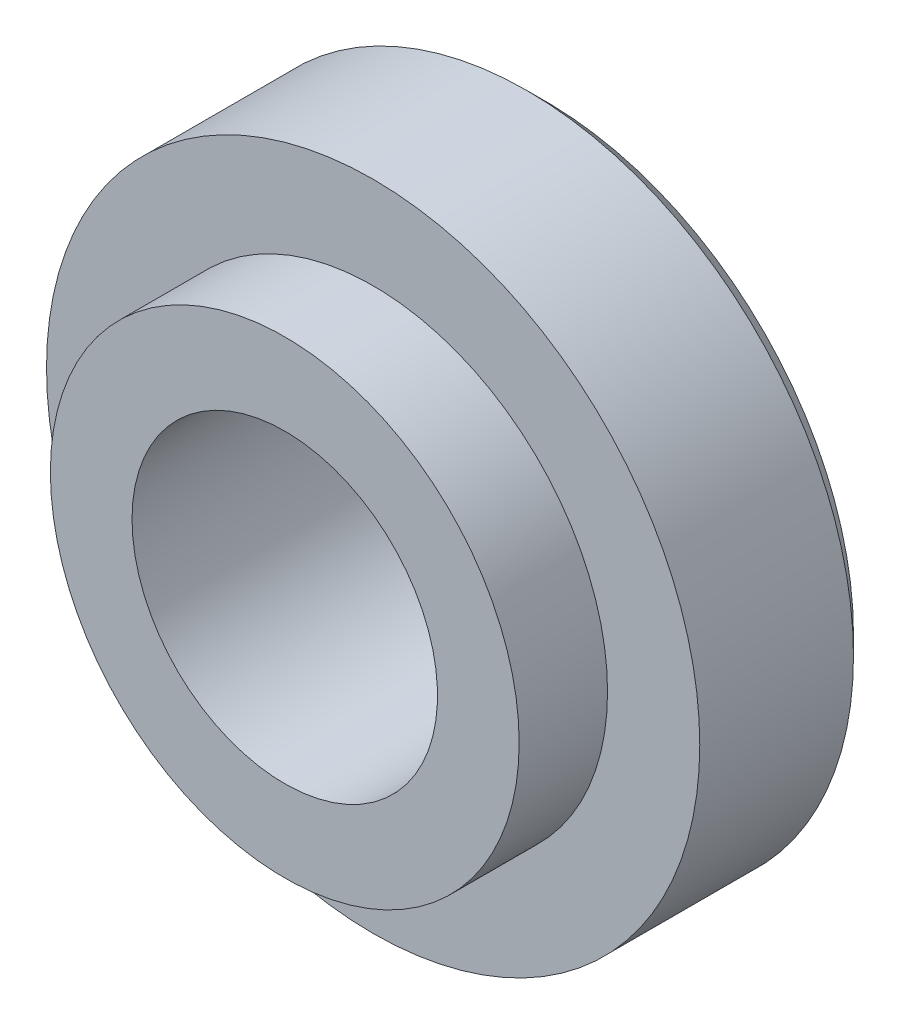
ISO-10303-21;
HEADER;
FILE_DESCRIPTION(('STEP AP214'),'2;1');
FILE_NAME('part.step','',(''),(''),'','','');
FILE_SCHEMA(('AUTOMOTIVE_DESIGN { 1 0 10303 214 1 1 1 1 }'));
ENDSEC;
DATA;
#1=APPLICATION_CONTEXT('core data for automotive mechanical design processes');
#2=APPLICATION_PROTOCOL_DEFINITION('international standard','automotive_design',2000,#1);
#3=PRODUCT_CONTEXT('',#1,'mechanical');
#4=PRODUCT('Part','Part','',(#3));
#5=PRODUCT_RELATED_PRODUCT_CATEGORY('part','',(#4));
#6=PRODUCT_DEFINITION_FORMATION('','',#4);
#7=PRODUCT_DEFINITION_CONTEXT('part definition',#1,'design');
#8=PRODUCT_DEFINITION('design','',#6,#7);
#9=PRODUCT_DEFINITION_SHAPE('','',#8);
#10=(LENGTH_UNIT() NAMED_UNIT(*) SI_UNIT(.MILLI.,.METRE.));
#11=(NAMED_UNIT(*) PLANE_ANGLE_UNIT() SI_UNIT($,.RADIAN.));
#12=(NAMED_UNIT(*) SI_UNIT($,.STERADIAN.) SOLID_ANGLE_UNIT());
#13=UNCERTAINTY_MEASURE_WITH_UNIT(LENGTH_MEASURE(1.E-05),#10,'distance_accuracy_value','');
#14=(GEOMETRIC_REPRESENTATION_CONTEXT(3) GLOBAL_UNCERTAINTY_ASSIGNED_CONTEXT((#13)) GLOBAL_UNIT_ASSIGNED_CONTEXT((#10,
#11,#12)) REPRESENTATION_CONTEXT('',''));
#15=CARTESIAN_POINT('',(0.,0.,0.));
#16=DIRECTION('',(0.,0.,1.));
#17=DIRECTION('',(1.,0.,0.));
#18=AXIS2_PLACEMENT_3D('',#15,#16,#17);
#19=CARTESIAN_POINT('',(0.,0.,-11.5238760512053));
#20=DIRECTION('',(0.,0.,-1.));
#21=DIRECTION('',(-1.,0.,0.));
#22=AXIS2_PLACEMENT_3D('',#19,#20,#21);
#23=CYLINDRICAL_SURFACE('',#22,2.0193);
#24=CARTESIAN_POINT('',(0.,0.,-2.286));
#25=DIRECTION('',(0.,0.,-1.));
#26=DIRECTION('',(-1.,0.,0.));
#27=AXIS2_PLACEMENT_3D('',#24,#25,#26);
#28=CIRCLE('',#27,2.0193);
#29=CARTESIAN_POINT('',(-2.0193,0.,-2.286));
#30=VERTEX_POINT('',#29);
#31=EDGE_CURVE('E38',#30,#30,#28,.F.);
#32=ORIENTED_EDGE('',*,*,#31,.F.);
#33=EDGE_LOOP('',(#32));
#34=FACE_BOUND('',#33,.T.);
#35=CARTESIAN_POINT('',(0.,0.,1.1684));
#36=DIRECTION('',(0.,0.,-1.));
#37=DIRECTION('',(-1.,0.,0.));
#38=AXIS2_PLACEMENT_3D('',#35,#36,#37);
#39=CIRCLE('',#38,2.0193);
#40=CARTESIAN_POINT('',(-2.0193,0.,1.1684));
#41=VERTEX_POINT('',#40);
#42=EDGE_CURVE('E17',#41,#41,#39,.T.);
#43=ORIENTED_EDGE('',*,*,#42,.F.);
#44=EDGE_LOOP('',(#43));
#45=FACE_BOUND('',#44,.T.);
#46=ADVANCED_FACE('F14',(#34,#45),#23,.F.);
#47=CARTESIAN_POINT('',(0.,0.,1.1684));
#48=DIRECTION('',(0.,0.,1.));
#49=DIRECTION('',(1.,0.,0.));
#50=AXIS2_PLACEMENT_3D('',#47,#48,#49);
#51=PLANE('',#50);
#52=ORIENTED_EDGE('',*,*,#42,.T.);
#53=EDGE_LOOP('',(#52));
#54=FACE_BOUND('',#53,.T.);
#55=CARTESIAN_POINT('',(0.,0.,1.1684));
#56=DIRECTION('',(0.,0.,-1.));
#57=DIRECTION('',(-1.,0.,0.));
#58=AXIS2_PLACEMENT_3D('',#55,#56,#57);
#59=CIRCLE('',#58,3.0988);
#60=CARTESIAN_POINT('',(-3.0988,0.,1.1684));
#61=VERTEX_POINT('',#60);
#62=EDGE_CURVE('E36',#61,#61,#59,.T.);
#63=ORIENTED_EDGE('',*,*,#62,.F.);
#64=EDGE_LOOP('',(#63));
#65=FACE_BOUND('',#64,.T.);
#66=ADVANCED_FACE('F45',(#54,#65),#51,.T.);
#67=CARTESIAN_POINT('',(4.318,0.,-2.286));
#68=DIRECTION('',(0.,0.,-1.));
#69=DIRECTION('',(-1.,0.,0.));
#70=AXIS2_PLACEMENT_3D('',#67,#68,#69);
#71=PLANE('',#70);
#72=ORIENTED_EDGE('',*,*,#31,.T.);
#73=EDGE_LOOP('',(#72));
#74=FACE_BOUND('',#73,.T.);
#75=CARTESIAN_POINT('',(0.,0.,-2.28600000002643));
#76=DIRECTION('',(0.,0.,1.));
#77=DIRECTION('',(1.,0.,0.));
#78=AXIS2_PLACEMENT_3D('',#75,#76,#77);
#79=CIRCLE('',#78,4.0639999999712);
#80=CARTESIAN_POINT('',(4.0639999999712,0.,-2.28600000002643));
#81=VERTEX_POINT('',#80);
#82=EDGE_CURVE('E33',#81,#81,#79,.T.);
#83=ORIENTED_EDGE('',*,*,#82,.F.);
#84=EDGE_LOOP('',(#83));
#85=FACE_BOUND('',#84,.T.);
#86=ADVANCED_FACE('F54',(#74,#85),#71,.T.);
#87=CARTESIAN_POINT('',(0.,0.,-4.699));
#88=DIRECTION('',(0.,0.,-1.));
#89=DIRECTION('',(-1.,0.,0.));
#90=AXIS2_PLACEMENT_3D('',#87,#88,#89);
#91=CYLINDRICAL_SURFACE('',#90,3.0988);
#92=ORIENTED_EDGE('',*,*,#62,.T.);
#93=EDGE_LOOP('',(#92));
#94=FACE_BOUND('',#93,.T.);
#95=CARTESIAN_POINT('',(0.,0.,0.));
#96=DIRECTION('',(0.,0.,-1.));
#97=DIRECTION('',(-1.,0.,0.));
#98=AXIS2_PLACEMENT_3D('',#95,#96,#97);
#99=CIRCLE('',#98,3.0988);
#100=CARTESIAN_POINT('',(-3.0988,0.,0.));
#101=VERTEX_POINT('',#100);
#102=EDGE_CURVE('E26',#101,#101,#99,.T.);
#103=ORIENTED_EDGE('',*,*,#102,.F.);
#104=EDGE_LOOP('',(#103));
#105=FACE_BOUND('',#104,.T.);
#106=ADVANCED_FACE('F69',(#94,#105),#91,.T.);
#107=CARTESIAN_POINT('',(0.,0.,-2.03200000004244));
#108=DIRECTION('',(0.,0.,1.));
#109=DIRECTION('',(1.,0.,0.));
#110=AXIS2_PLACEMENT_3D('',#107,#108,#109);
#111=CONICAL_SURFACE('',#110,4.31799999995519,0.785398163397448);
#112=CARTESIAN_POINT('',(0.,0.,-2.032));
#113=DIRECTION('',(0.,0.,-1.));
#114=DIRECTION('',(-1.,0.,0.));
#115=AXIS2_PLACEMENT_3D('',#112,#113,#114);
#116=CIRCLE('',#115,4.318);
#117=CARTESIAN_POINT('',(-4.318,0.,-2.032));
#118=VERTEX_POINT('',#117);
#119=EDGE_CURVE('E21',#118,#118,#116,.F.);
#120=ORIENTED_EDGE('',*,*,#119,.F.);
#121=EDGE_LOOP('',(#120));
#122=FACE_BOUND('',#121,.T.);
#123=ORIENTED_EDGE('',*,*,#82,.T.);
#124=EDGE_LOOP('',(#123));
#125=FACE_BOUND('',#124,.T.);
#126=ADVANCED_FACE('F62',(#122,#125),#111,.T.);
#127=CARTESIAN_POINT('',(3.0988,0.,0.));
#128=DIRECTION('',(0.,0.,1.));
#129=DIRECTION('',(1.,0.,0.));
#130=AXIS2_PLACEMENT_3D('',#127,#128,#129);
#131=PLANE('',#130);
#132=ORIENTED_EDGE('',*,*,#102,.T.);
#133=EDGE_LOOP('',(#132));
#134=FACE_BOUND('',#133,.T.);
#135=CARTESIAN_POINT('',(0.,0.,0.));
#136=DIRECTION('',(0.,0.,-1.));
#137=DIRECTION('',(-1.,0.,0.));
#138=AXIS2_PLACEMENT_3D('',#135,#136,#137);
#139=CIRCLE('',#138,4.318);
#140=CARTESIAN_POINT('',(-4.318,0.,0.));
#141=VERTEX_POINT('',#140);
#142=EDGE_CURVE('E10',#141,#141,#139,.T.);
#143=ORIENTED_EDGE('',*,*,#142,.F.);
#144=EDGE_LOOP('',(#143));
#145=FACE_BOUND('',#144,.T.);
#146=ADVANCED_FACE('F57',(#134,#145),#131,.T.);
#147=CARTESIAN_POINT('',(0.,0.,-4.699));
#148=DIRECTION('',(0.,0.,-1.));
#149=DIRECTION('',(-1.,0.,0.));
#150=AXIS2_PLACEMENT_3D('',#147,#148,#149);
#151=CYLINDRICAL_SURFACE('',#150,4.318);
#152=ORIENTED_EDGE('',*,*,#142,.T.);
#153=EDGE_LOOP('',(#152));
#154=FACE_BOUND('',#153,.T.);
#155=ORIENTED_EDGE('',*,*,#119,.T.);
#156=EDGE_LOOP('',(#155));
#157=FACE_BOUND('',#156,.T.);
#158=ADVANCED_FACE('F55',(#154,#157),#151,.T.);
#159=CLOSED_SHELL('',(#46,#66,#86,#106,#126,#146,#158));
#160=MANIFOLD_SOLID_BREP('B1',#159);
#161=ADVANCED_BREP_SHAPE_REPRESENTATION('',(#18,#160),#14);
#162=SHAPE_DEFINITION_REPRESENTATION(#9,#161);
ENDSEC;
END-ISO-10303-21;
